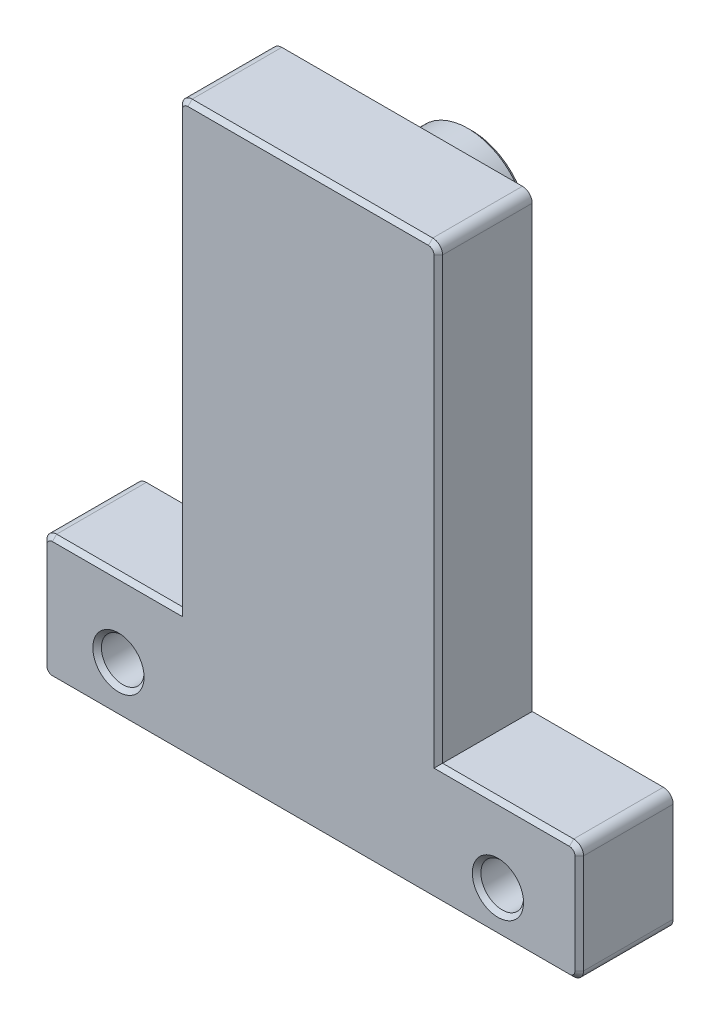
ISO-10303-21;
HEADER;
FILE_DESCRIPTION(('STEP AP214'),'2;1');
FILE_NAME('part.step','',(''),(''),'','','');
FILE_SCHEMA(('AUTOMOTIVE_DESIGN { 1 0 10303 214 1 1 1 1 }'));
ENDSEC;
DATA;
#1=APPLICATION_CONTEXT('core data for automotive mechanical design processes');
#2=APPLICATION_PROTOCOL_DEFINITION('international standard','automotive_design',2000,#1);
#3=PRODUCT_CONTEXT('',#1,'mechanical');
#4=PRODUCT('Part','Part','',(#3));
#5=PRODUCT_RELATED_PRODUCT_CATEGORY('part','',(#4));
#6=PRODUCT_DEFINITION_FORMATION('','',#4);
#7=PRODUCT_DEFINITION_CONTEXT('part definition',#1,'design');
#8=PRODUCT_DEFINITION('design','',#6,#7);
#9=PRODUCT_DEFINITION_SHAPE('','',#8);
#10=(LENGTH_UNIT() NAMED_UNIT(*) SI_UNIT(.MILLI.,.METRE.));
#11=(NAMED_UNIT(*) PLANE_ANGLE_UNIT() SI_UNIT($,.RADIAN.));
#12=(NAMED_UNIT(*) SI_UNIT($,.STERADIAN.) SOLID_ANGLE_UNIT());
#13=UNCERTAINTY_MEASURE_WITH_UNIT(LENGTH_MEASURE(1.E-05),#10,'distance_accuracy_value','');
#14=(GEOMETRIC_REPRESENTATION_CONTEXT(3) GLOBAL_UNCERTAINTY_ASSIGNED_CONTEXT((#13)) GLOBAL_UNIT_ASSIGNED_CONTEXT((#10,
#11,#12)) REPRESENTATION_CONTEXT('',''));
#15=CARTESIAN_POINT('',(0.,0.,0.));
#16=DIRECTION('',(0.,0.,1.));
#17=DIRECTION('',(1.,0.,0.));
#18=AXIS2_PLACEMENT_3D('',#15,#16,#17);
#19=CARTESIAN_POINT('',(73.787,72.009,2.2));
#20=DIRECTION('',(1.,0.,0.));
#21=DIRECTION('',(0.,0.,-1.));
#22=AXIS2_PLACEMENT_3D('',#19,#20,#21);
#23=PLANE('',#22);
#24=DIRECTION('',(0.,0.,-1.));
#25=VECTOR('',#24,1.);
#26=CARTESIAN_POINT('',(73.787,69.318,2.2));
#27=LINE('',#26,#25);
#28=CARTESIAN_POINT('',(73.787,69.318,0.));
#29=VERTEX_POINT('',#28);
#30=CARTESIAN_POINT('',(73.787,69.318,2.1));
#31=VERTEX_POINT('',#30);
#32=EDGE_CURVE('E261',#29,#31,#27,.F.);
#33=ORIENTED_EDGE('',*,*,#32,.T.);
#34=DIRECTION('',(0.,1.,0.));
#35=VECTOR('',#34,1.);
#36=CARTESIAN_POINT('',(73.787,72.009,2.1));
#37=LINE('',#36,#35);
#38=CARTESIAN_POINT('',(73.787,71.779,2.1));
#39=VERTEX_POINT('',#38);
#40=EDGE_CURVE('E370',#31,#39,#37,.T.);
#41=ORIENTED_EDGE('',*,*,#40,.T.);
#42=DIRECTION('',(0.,0.,-1.));
#43=VECTOR('',#42,1.);
#44=CARTESIAN_POINT('',(73.787,71.779,2.2));
#45=LINE('',#44,#43);
#46=CARTESIAN_POINT('',(73.787,71.779,0.));
#47=VERTEX_POINT('',#46);
#48=EDGE_CURVE('E258',#39,#47,#45,.T.);
#49=ORIENTED_EDGE('',*,*,#48,.T.);
#50=DIRECTION('',(0.,-1.,0.));
#51=VECTOR('',#50,1.);
#52=CARTESIAN_POINT('',(73.787,72.009,0.));
#53=LINE('',#52,#51);
#54=EDGE_CURVE('E475',#47,#29,#53,.T.);
#55=ORIENTED_EDGE('',*,*,#54,.T.);
#56=EDGE_LOOP('',(#33,#41,#49,#55));
#57=FACE_BOUND('',#56,.T.);
#58=ADVANCED_FACE('F41',(#57),#23,.F.);
#59=CARTESIAN_POINT('',(82.804,69.088,2.2));
#60=DIRECTION('',(0.,1.,0.));
#61=DIRECTION('',(0.,0.,1.));
#62=AXIS2_PLACEMENT_3D('',#59,#60,#61);
#63=PLANE('',#62);
#64=DIRECTION('',(0.,0.,-1.));
#65=VECTOR('',#64,1.);
#66=CARTESIAN_POINT('',(86.13,69.088,2.2));
#67=LINE('',#66,#65);
#68=CARTESIAN_POINT('',(86.13,69.088,0.));
#69=VERTEX_POINT('',#68);
#70=CARTESIAN_POINT('',(86.13,69.088,2.1));
#71=VERTEX_POINT('',#70);
#72=EDGE_CURVE('E200',#69,#71,#67,.F.);
#73=ORIENTED_EDGE('',*,*,#72,.T.);
#74=DIRECTION('',(-1.,0.,0.));
#75=VECTOR('',#74,1.);
#76=CARTESIAN_POINT('',(82.804,69.088,2.1));
#77=LINE('',#76,#75);
#78=CARTESIAN_POINT('',(74.017,69.088,2.1));
#79=VERTEX_POINT('',#78);
#80=EDGE_CURVE('E66',#71,#79,#77,.T.);
#81=ORIENTED_EDGE('',*,*,#80,.T.);
#82=DIRECTION('',(0.,0.,-1.));
#83=VECTOR('',#82,1.);
#84=CARTESIAN_POINT('',(74.017,69.088,2.2));
#85=LINE('',#84,#83);
#86=CARTESIAN_POINT('',(74.017,69.088,0.));
#87=VERTEX_POINT('',#86);
#88=EDGE_CURVE('E238',#79,#87,#85,.T.);
#89=ORIENTED_EDGE('',*,*,#88,.T.);
#90=DIRECTION('',(1.,0.,0.));
#91=VECTOR('',#90,1.);
#92=CARTESIAN_POINT('',(82.804,69.088,0.));
#93=LINE('',#92,#91);
#94=EDGE_CURVE('E479',#87,#69,#93,.T.);
#95=ORIENTED_EDGE('',*,*,#94,.T.);
#96=EDGE_LOOP('',(#73,#81,#89,#95));
#97=FACE_BOUND('',#96,.T.);
#98=ADVANCED_FACE('F507',(#97),#63,.F.);
#99=CARTESIAN_POINT('',(86.36,71.882,2.2));
#100=DIRECTION('',(-1.,0.,0.));
#101=DIRECTION('',(0.,0.,1.));
#102=AXIS2_PLACEMENT_3D('',#99,#100,#101);
#103=PLANE('',#102);
#104=DIRECTION('',(0.,0.,-1.));
#105=VECTOR('',#104,1.);
#106=CARTESIAN_POINT('',(86.36,71.652,2.2));
#107=LINE('',#106,#105);
#108=CARTESIAN_POINT('',(86.36,71.652,0.));
#109=VERTEX_POINT('',#108);
#110=CARTESIAN_POINT('',(86.36,71.652,2.1));
#111=VERTEX_POINT('',#110);
#112=EDGE_CURVE('E281',#109,#111,#107,.F.);
#113=ORIENTED_EDGE('',*,*,#112,.T.);
#114=DIRECTION('',(0.,-1.,0.));
#115=VECTOR('',#114,1.);
#116=CARTESIAN_POINT('',(86.36,71.882,2.1));
#117=LINE('',#116,#115);
#118=CARTESIAN_POINT('',(86.36,69.318,2.1));
#119=VERTEX_POINT('',#118);
#120=EDGE_CURVE('E360',#111,#119,#117,.T.);
#121=ORIENTED_EDGE('',*,*,#120,.T.);
#122=DIRECTION('',(0.,0.,-1.));
#123=VECTOR('',#122,1.);
#124=CARTESIAN_POINT('',(86.36,69.318,2.2));
#125=LINE('',#124,#123);
#126=CARTESIAN_POINT('',(86.36,69.318,0.));
#127=VERTEX_POINT('',#126);
#128=EDGE_CURVE('E285',#119,#127,#125,.T.);
#129=ORIENTED_EDGE('',*,*,#128,.T.);
#130=DIRECTION('',(0.,1.,0.));
#131=VECTOR('',#130,1.);
#132=CARTESIAN_POINT('',(86.36,71.882,0.));
#133=LINE('',#132,#131);
#134=EDGE_CURVE('E211',#127,#109,#133,.T.);
#135=ORIENTED_EDGE('',*,*,#134,.T.);
#136=EDGE_LOOP('',(#113,#121,#129,#135));
#137=FACE_BOUND('',#136,.T.);
#138=ADVANCED_FACE('F487',(#137),#103,.F.);
#139=CARTESIAN_POINT('',(83.058,71.882,2.2));
#140=DIRECTION('',(0.,-1.,0.));
#141=DIRECTION('',(0.,0.,-1.));
#142=AXIS2_PLACEMENT_3D('',#139,#140,#141);
#143=PLANE('',#142);
#144=DIRECTION('',(0.,0.,-1.));
#145=VECTOR('',#144,1.);
#146=CARTESIAN_POINT('',(83.058,71.882,2.2));
#147=LINE('',#146,#145);
#148=CARTESIAN_POINT('',(83.058,71.882,2.1));
#149=VERTEX_POINT('',#148);
#150=CARTESIAN_POINT('',(83.058,71.882,0.));
#151=VERTEX_POINT('',#150);
#152=EDGE_CURVE('E188',#149,#151,#147,.T.);
#153=ORIENTED_EDGE('',*,*,#152,.F.);
#154=DIRECTION('',(1.,0.,0.));
#155=VECTOR('',#154,1.);
#156=CARTESIAN_POINT('',(83.058,71.882,2.1));
#157=LINE('',#156,#155);
#158=CARTESIAN_POINT('',(86.13,71.882,2.1));
#159=VERTEX_POINT('',#158);
#160=EDGE_CURVE('E354',#149,#159,#157,.T.);
#161=ORIENTED_EDGE('',*,*,#160,.T.);
#162=DIRECTION('',(0.,0.,-1.));
#163=VECTOR('',#162,1.);
#164=CARTESIAN_POINT('',(86.13,71.882,2.2));
#165=LINE('',#164,#163);
#166=CARTESIAN_POINT('',(86.13,71.882,0.));
#167=VERTEX_POINT('',#166);
#168=EDGE_CURVE('E207',#159,#167,#165,.T.);
#169=ORIENTED_EDGE('',*,*,#168,.T.);
#170=DIRECTION('',(-1.,0.,0.));
#171=VECTOR('',#170,1.);
#172=CARTESIAN_POINT('',(83.058,71.882,0.));
#173=LINE('',#172,#171);
#174=EDGE_CURVE('E204',#167,#151,#173,.T.);
#175=ORIENTED_EDGE('',*,*,#174,.T.);
#176=EDGE_LOOP('',(#153,#161,#169,#175));
#177=FACE_BOUND('',#176,.T.);
#178=ADVANCED_FACE('F205',(#177),#143,.F.);
#179=CARTESIAN_POINT('',(83.058,82.423,2.2));
#180=DIRECTION('',(-1.,0.,0.));
#181=DIRECTION('',(0.,0.,1.));
#182=AXIS2_PLACEMENT_3D('',#179,#180,#181);
#183=PLANE('',#182);
#184=DIRECTION('',(0.,0.,-1.));
#185=VECTOR('',#184,1.);
#186=CARTESIAN_POINT('',(83.058,82.193,2.2));
#187=LINE('',#186,#185);
#188=CARTESIAN_POINT('',(83.058,82.193,0.));
#189=VERTEX_POINT('',#188);
#190=CARTESIAN_POINT('',(83.058,82.193,2.1));
#191=VERTEX_POINT('',#190);
#192=EDGE_CURVE('E278',#189,#191,#187,.F.);
#193=ORIENTED_EDGE('',*,*,#192,.T.);
#194=DIRECTION('',(0.,-1.,0.));
#195=VECTOR('',#194,1.);
#196=CARTESIAN_POINT('',(83.058,82.423,2.1));
#197=LINE('',#196,#195);
#198=EDGE_CURVE('E196',#191,#149,#197,.T.);
#199=ORIENTED_EDGE('',*,*,#198,.T.);
#200=ORIENTED_EDGE('',*,*,#152,.T.);
#201=DIRECTION('',(0.,1.,0.));
#202=VECTOR('',#201,1.);
#203=CARTESIAN_POINT('',(83.058,82.423,0.));
#204=LINE('',#203,#202);
#205=EDGE_CURVE('E193',#151,#189,#204,.T.);
#206=ORIENTED_EDGE('',*,*,#205,.T.);
#207=EDGE_LOOP('',(#193,#199,#200,#206));
#208=FACE_BOUND('',#207,.T.);
#209=ADVANCED_FACE('F191',(#208),#183,.F.);
#210=CARTESIAN_POINT('',(76.962,82.423,2.2));
#211=DIRECTION('',(0.,-1.,0.));
#212=DIRECTION('',(0.,0.,-1.));
#213=AXIS2_PLACEMENT_3D('',#210,#211,#212);
#214=PLANE('',#213);
#215=DIRECTION('',(0.,0.,-1.));
#216=VECTOR('',#215,1.);
#217=CARTESIAN_POINT('',(77.192,82.423,2.2));
#218=LINE('',#217,#216);
#219=CARTESIAN_POINT('',(77.192,82.423,0.));
#220=VERTEX_POINT('',#219);
#221=CARTESIAN_POINT('',(77.192,82.423,2.1));
#222=VERTEX_POINT('',#221);
#223=EDGE_CURVE('E274',#220,#222,#218,.F.);
#224=ORIENTED_EDGE('',*,*,#223,.T.);
#225=DIRECTION('',(1.,0.,0.));
#226=VECTOR('',#225,1.);
#227=CARTESIAN_POINT('',(76.962,82.423,2.1));
#228=LINE('',#227,#226);
#229=CARTESIAN_POINT('',(82.828,82.423,2.1));
#230=VERTEX_POINT('',#229);
#231=EDGE_CURVE('E346',#222,#230,#228,.T.);
#232=ORIENTED_EDGE('',*,*,#231,.T.);
#233=DIRECTION('',(0.,0.,-1.));
#234=VECTOR('',#233,1.);
#235=CARTESIAN_POINT('',(82.828,82.423,2.2));
#236=LINE('',#235,#234);
#237=CARTESIAN_POINT('',(82.828,82.423,0.));
#238=VERTEX_POINT('',#237);
#239=EDGE_CURVE('E271',#230,#238,#236,.T.);
#240=ORIENTED_EDGE('',*,*,#239,.T.);
#241=DIRECTION('',(-1.,0.,0.));
#242=VECTOR('',#241,1.);
#243=CARTESIAN_POINT('',(76.962,82.423,0.));
#244=LINE('',#243,#242);
#245=EDGE_CURVE('E219',#238,#220,#244,.T.);
#246=ORIENTED_EDGE('',*,*,#245,.T.);
#247=EDGE_LOOP('',(#224,#232,#240,#246));
#248=FACE_BOUND('',#247,.T.);
#249=ADVANCED_FACE('F536',(#248),#214,.F.);
#250=CARTESIAN_POINT('',(76.962,72.009,2.2));
#251=DIRECTION('',(1.,0.,0.));
#252=DIRECTION('',(0.,0.,-1.));
#253=AXIS2_PLACEMENT_3D('',#250,#251,#252);
#254=PLANE('',#253);
#255=DIRECTION('',(0.,0.,-1.));
#256=VECTOR('',#255,1.);
#257=CARTESIAN_POINT('',(76.962,72.009,2.2));
#258=LINE('',#257,#256);
#259=CARTESIAN_POINT('',(76.962,72.009,2.1));
#260=VERTEX_POINT('',#259);
#261=CARTESIAN_POINT('',(76.962,72.009,0.));
#262=VERTEX_POINT('',#261);
#263=EDGE_CURVE('E201',#260,#262,#258,.T.);
#264=ORIENTED_EDGE('',*,*,#263,.F.);
#265=DIRECTION('',(0.,1.,0.));
#266=VECTOR('',#265,1.);
#267=CARTESIAN_POINT('',(76.962,72.009,2.1));
#268=LINE('',#267,#266);
#269=CARTESIAN_POINT('',(76.962,82.193,2.1));
#270=VERTEX_POINT('',#269);
#271=EDGE_CURVE('E340',#260,#270,#268,.T.);
#272=ORIENTED_EDGE('',*,*,#271,.T.);
#273=DIRECTION('',(0.,0.,-1.));
#274=VECTOR('',#273,1.);
#275=CARTESIAN_POINT('',(76.962,82.193,2.2));
#276=LINE('',#275,#274);
#277=CARTESIAN_POINT('',(76.962,82.193,0.));
#278=VERTEX_POINT('',#277);
#279=EDGE_CURVE('E268',#270,#278,#276,.T.);
#280=ORIENTED_EDGE('',*,*,#279,.T.);
#281=DIRECTION('',(0.,-1.,0.));
#282=VECTOR('',#281,1.);
#283=CARTESIAN_POINT('',(76.962,72.009,0.));
#284=LINE('',#283,#282);
#285=EDGE_CURVE('E223',#278,#262,#284,.T.);
#286=ORIENTED_EDGE('',*,*,#285,.T.);
#287=EDGE_LOOP('',(#264,#272,#280,#286));
#288=FACE_BOUND('',#287,.T.);
#289=ADVANCED_FACE('F530',(#288),#254,.F.);
#290=CARTESIAN_POINT('',(73.787,72.009,2.2));
#291=DIRECTION('',(0.,-1.,0.));
#292=DIRECTION('',(0.,0.,-1.));
#293=AXIS2_PLACEMENT_3D('',#290,#291,#292);
#294=PLANE('',#293);
#295=DIRECTION('',(0.,0.,-1.));
#296=VECTOR('',#295,1.);
#297=CARTESIAN_POINT('',(74.017,72.009,2.2));
#298=LINE('',#297,#296);
#299=CARTESIAN_POINT('',(74.017,72.009,0.));
#300=VERTEX_POINT('',#299);
#301=CARTESIAN_POINT('',(74.017,72.009,2.1));
#302=VERTEX_POINT('',#301);
#303=EDGE_CURVE('E264',#300,#302,#298,.F.);
#304=ORIENTED_EDGE('',*,*,#303,.T.);
#305=DIRECTION('',(1.,0.,0.));
#306=VECTOR('',#305,1.);
#307=CARTESIAN_POINT('',(73.787,72.009,2.1));
#308=LINE('',#307,#306);
#309=EDGE_CURVE('E337',#302,#260,#308,.T.);
#310=ORIENTED_EDGE('',*,*,#309,.T.);
#311=ORIENTED_EDGE('',*,*,#263,.T.);
#312=DIRECTION('',(-1.,0.,0.));
#313=VECTOR('',#312,1.);
#314=CARTESIAN_POINT('',(73.787,72.009,0.));
#315=LINE('',#314,#313);
#316=EDGE_CURVE('E230',#262,#300,#315,.T.);
#317=ORIENTED_EDGE('',*,*,#316,.T.);
#318=EDGE_LOOP('',(#304,#310,#311,#317));
#319=FACE_BOUND('',#318,.T.);
#320=ADVANCED_FACE('F525',(#319),#294,.F.);
#321=CARTESIAN_POINT('',(0.,0.,2.2));
#322=DIRECTION('',(0.,0.,-1.));
#323=DIRECTION('',(-1.,0.,0.));
#324=AXIS2_PLACEMENT_3D('',#321,#322,#323);
#325=PLANE('',#324);
#326=CARTESIAN_POINT('',(84.455,70.104,2.2));
#327=DIRECTION('',(0.,0.,-1.));
#328=DIRECTION('',(-1.,0.,0.));
#329=AXIS2_PLACEMENT_3D('',#326,#327,#328);
#330=CIRCLE('',#329,0.600000000000003);
#331=CARTESIAN_POINT('',(83.855,70.104,2.2));
#332=VERTEX_POINT('',#331);
#333=EDGE_CURVE('E51',#332,#332,#330,.T.);
#334=ORIENTED_EDGE('',*,*,#333,.T.);
#335=EDGE_LOOP('',(#334));
#336=FACE_BOUND('',#335,.T.);
#337=CARTESIAN_POINT('',(75.565,70.231,2.2));
#338=DIRECTION('',(0.,0.,-1.));
#339=DIRECTION('',(-1.,0.,0.));
#340=AXIS2_PLACEMENT_3D('',#337,#338,#339);
#341=CIRCLE('',#340,0.600000000000003);
#342=CARTESIAN_POINT('',(74.965,70.231,2.2));
#343=VERTEX_POINT('',#342);
#344=EDGE_CURVE('E441',#343,#343,#341,.T.);
#345=ORIENTED_EDGE('',*,*,#344,.T.);
#346=EDGE_LOOP('',(#345));
#347=FACE_BOUND('',#346,.T.);
#348=DIRECTION('',(-1.,0.,0.));
#349=VECTOR('',#348,1.);
#350=CARTESIAN_POINT('',(0.,71.909,2.2));
#351=LINE('',#350,#349);
#352=CARTESIAN_POINT('',(77.062,71.909,2.2));
#353=VERTEX_POINT('',#352);
#354=CARTESIAN_POINT('',(74.017,71.909,2.2));
#355=VERTEX_POINT('',#354);
#356=EDGE_CURVE('E326',#353,#355,#351,.T.);
#357=ORIENTED_EDGE('',*,*,#356,.T.);
#358=CARTESIAN_POINT('',(74.017,71.779,2.2));
#359=DIRECTION('',(0.,0.,-1.));
#360=DIRECTION('',(-1.,0.,0.));
#361=AXIS2_PLACEMENT_3D('',#358,#359,#360);
#362=CIRCLE('',#361,0.129999999999991);
#363=CARTESIAN_POINT('',(73.887,71.779,2.2));
#364=VERTEX_POINT('',#363);
#365=EDGE_CURVE('E329',#355,#364,#362,.F.);
#366=ORIENTED_EDGE('',*,*,#365,.T.);
#367=DIRECTION('',(0.,-1.,0.));
#368=VECTOR('',#367,1.);
#369=CARTESIAN_POINT('',(73.887,0.,2.2));
#370=LINE('',#369,#368);
#371=CARTESIAN_POINT('',(73.887,69.318,2.2));
#372=VERTEX_POINT('',#371);
#373=EDGE_CURVE('E290',#364,#372,#370,.T.);
#374=ORIENTED_EDGE('',*,*,#373,.T.);
#375=CARTESIAN_POINT('',(74.017,69.318,2.2));
#376=DIRECTION('',(0.,0.,-1.));
#377=DIRECTION('',(-1.,0.,0.));
#378=AXIS2_PLACEMENT_3D('',#375,#376,#377);
#379=CIRCLE('',#378,0.129999999999991);
#380=CARTESIAN_POINT('',(74.017,69.188,2.2));
#381=VERTEX_POINT('',#380);
#382=EDGE_CURVE('E293',#372,#381,#379,.F.);
#383=ORIENTED_EDGE('',*,*,#382,.T.);
#384=DIRECTION('',(1.,0.,0.));
#385=VECTOR('',#384,1.);
#386=CARTESIAN_POINT('',(0.,69.188,2.2));
#387=LINE('',#386,#385);
#388=CARTESIAN_POINT('',(86.13,69.188,2.2));
#389=VERTEX_POINT('',#388);
#390=EDGE_CURVE('E296',#381,#389,#387,.T.);
#391=ORIENTED_EDGE('',*,*,#390,.T.);
#392=CARTESIAN_POINT('',(86.13,69.318,2.2));
#393=DIRECTION('',(0.,0.,-1.));
#394=DIRECTION('',(-1.,0.,0.));
#395=AXIS2_PLACEMENT_3D('',#392,#393,#394);
#396=CIRCLE('',#395,0.129999999999991);
#397=CARTESIAN_POINT('',(86.26,69.318,2.2));
#398=VERTEX_POINT('',#397);
#399=EDGE_CURVE('E299',#389,#398,#396,.F.);
#400=ORIENTED_EDGE('',*,*,#399,.T.);
#401=DIRECTION('',(0.,1.,0.));
#402=VECTOR('',#401,1.);
#403=CARTESIAN_POINT('',(86.26,0.,2.2));
#404=LINE('',#403,#402);
#405=CARTESIAN_POINT('',(86.26,71.652,2.2));
#406=VERTEX_POINT('',#405);
#407=EDGE_CURVE('E302',#398,#406,#404,.T.);
#408=ORIENTED_EDGE('',*,*,#407,.T.);
#409=CARTESIAN_POINT('',(86.13,71.652,2.2));
#410=DIRECTION('',(0.,0.,-1.));
#411=DIRECTION('',(-1.,0.,0.));
#412=AXIS2_PLACEMENT_3D('',#409,#410,#411);
#413=CIRCLE('',#412,0.129999999999991);
#414=CARTESIAN_POINT('',(86.13,71.782,2.2));
#415=VERTEX_POINT('',#414);
#416=EDGE_CURVE('E305',#406,#415,#413,.F.);
#417=ORIENTED_EDGE('',*,*,#416,.T.);
#418=DIRECTION('',(-1.,0.,0.));
#419=VECTOR('',#418,1.);
#420=CARTESIAN_POINT('',(0.,71.782,2.2));
#421=LINE('',#420,#419);
#422=CARTESIAN_POINT('',(82.958,71.782,2.2));
#423=VERTEX_POINT('',#422);
#424=EDGE_CURVE('E308',#415,#423,#421,.T.);
#425=ORIENTED_EDGE('',*,*,#424,.T.);
#426=DIRECTION('',(0.,1.,0.));
#427=VECTOR('',#426,1.);
#428=CARTESIAN_POINT('',(82.958,0.,2.2));
#429=LINE('',#428,#427);
#430=CARTESIAN_POINT('',(82.958,82.193,2.2));
#431=VERTEX_POINT('',#430);
#432=EDGE_CURVE('E311',#423,#431,#429,.T.);
#433=ORIENTED_EDGE('',*,*,#432,.T.);
#434=CARTESIAN_POINT('',(82.828,82.193,2.2));
#435=DIRECTION('',(0.,0.,-1.));
#436=DIRECTION('',(-1.,0.,0.));
#437=AXIS2_PLACEMENT_3D('',#434,#435,#436);
#438=CIRCLE('',#437,0.129999999999991);
#439=CARTESIAN_POINT('',(82.828,82.323,2.2));
#440=VERTEX_POINT('',#439);
#441=EDGE_CURVE('E314',#431,#440,#438,.F.);
#442=ORIENTED_EDGE('',*,*,#441,.T.);
#443=DIRECTION('',(-1.,0.,0.));
#444=VECTOR('',#443,1.);
#445=CARTESIAN_POINT('',(0.,82.323,2.2));
#446=LINE('',#445,#444);
#447=CARTESIAN_POINT('',(77.192,82.323,2.2));
#448=VERTEX_POINT('',#447);
#449=EDGE_CURVE('E317',#440,#448,#446,.T.);
#450=ORIENTED_EDGE('',*,*,#449,.T.);
#451=CARTESIAN_POINT('',(77.192,82.193,2.2));
#452=DIRECTION('',(0.,0.,-1.));
#453=DIRECTION('',(-1.,0.,0.));
#454=AXIS2_PLACEMENT_3D('',#451,#452,#453);
#455=CIRCLE('',#454,0.129999999999991);
#456=CARTESIAN_POINT('',(77.062,82.193,2.2));
#457=VERTEX_POINT('',#456);
#458=EDGE_CURVE('E320',#448,#457,#455,.F.);
#459=ORIENTED_EDGE('',*,*,#458,.T.);
#460=DIRECTION('',(0.,-1.,0.));
#461=VECTOR('',#460,1.);
#462=CARTESIAN_POINT('',(77.062,0.,2.2));
#463=LINE('',#462,#461);
#464=EDGE_CURVE('E323',#457,#353,#463,.T.);
#465=ORIENTED_EDGE('',*,*,#464,.T.);
#466=EDGE_LOOP('',(#357,#366,#374,#383,#391,#400,#408,#417,#425,#433,#442,#450,#459,#465));
#467=FACE_BOUND('',#466,.T.);
#468=ADVANCED_FACE('F448',(#336,#347,#467),#325,.F.);
#469=CARTESIAN_POINT('',(0.,0.,0.));
#470=DIRECTION('',(0.,0.,-1.));
#471=DIRECTION('',(-1.,0.,0.));
#472=AXIS2_PLACEMENT_3D('',#469,#470,#471);
#473=PLANE('',#472);
#474=CARTESIAN_POINT('',(75.565,70.231,0.));
#475=DIRECTION('',(0.,0.,-1.));
#476=DIRECTION('',(-1.,0.,0.));
#477=AXIS2_PLACEMENT_3D('',#474,#475,#476);
#478=CIRCLE('',#477,0.499999999999999);
#479=CARTESIAN_POINT('',(75.065,70.231,0.));
#480=VERTEX_POINT('',#479);
#481=EDGE_CURVE('E386',#480,#480,#478,.T.);
#482=ORIENTED_EDGE('',*,*,#481,.F.);
#483=EDGE_LOOP('',(#482));
#484=FACE_BOUND('',#483,.T.);
#485=CARTESIAN_POINT('',(84.455,70.104,0.));
#486=DIRECTION('',(0.,0.,-1.));
#487=DIRECTION('',(-1.,0.,0.));
#488=AXIS2_PLACEMENT_3D('',#485,#486,#487);
#489=CIRCLE('',#488,0.499999999999999);
#490=CARTESIAN_POINT('',(83.955,70.104,0.));
#491=VERTEX_POINT('',#490);
#492=EDGE_CURVE('E464',#491,#491,#489,.T.);
#493=ORIENTED_EDGE('',*,*,#492,.F.);
#494=EDGE_LOOP('',(#493));
#495=FACE_BOUND('',#494,.T.);
#496=CARTESIAN_POINT('',(80.00000002,80.00000002,0.));
#497=DIRECTION('',(0.,0.,-1.));
#498=DIRECTION('',(-1.,0.,0.));
#499=AXIS2_PLACEMENT_3D('',#496,#497,#498);
#500=CIRCLE('',#499,1.41);
#501=CARTESIAN_POINT('',(78.59000002,80.00000002,0.));
#502=VERTEX_POINT('',#501);
#503=EDGE_CURVE('E437',#502,#502,#500,.T.);
#504=ORIENTED_EDGE('',*,*,#503,.F.);
#505=EDGE_LOOP('',(#504));
#506=FACE_BOUND('',#505,.T.);
#507=ORIENTED_EDGE('',*,*,#94,.F.);
#508=CARTESIAN_POINT('',(74.017,69.318,0.));
#509=DIRECTION('',(0.,0.,-1.));
#510=DIRECTION('',(-1.,0.,0.));
#511=AXIS2_PLACEMENT_3D('',#508,#509,#510);
#512=CIRCLE('',#511,0.23);
#513=EDGE_CURVE('E255',#87,#29,#512,.T.);
#514=ORIENTED_EDGE('',*,*,#513,.T.);
#515=ORIENTED_EDGE('',*,*,#54,.F.);
#516=CARTESIAN_POINT('',(74.017,71.779,0.));
#517=DIRECTION('',(0.,0.,-1.));
#518=DIRECTION('',(-1.,0.,0.));
#519=AXIS2_PLACEMENT_3D('',#516,#517,#518);
#520=CIRCLE('',#519,0.23);
#521=EDGE_CURVE('E252',#47,#300,#520,.T.);
#522=ORIENTED_EDGE('',*,*,#521,.T.);
#523=ORIENTED_EDGE('',*,*,#316,.F.);
#524=ORIENTED_EDGE('',*,*,#285,.F.);
#525=CARTESIAN_POINT('',(77.192,82.193,0.));
#526=DIRECTION('',(0.,0.,-1.));
#527=DIRECTION('',(-1.,0.,0.));
#528=AXIS2_PLACEMENT_3D('',#525,#526,#527);
#529=CIRCLE('',#528,0.23);
#530=EDGE_CURVE('E249',#278,#220,#529,.T.);
#531=ORIENTED_EDGE('',*,*,#530,.T.);
#532=ORIENTED_EDGE('',*,*,#245,.F.);
#533=CARTESIAN_POINT('',(82.828,82.193,0.));
#534=DIRECTION('',(0.,0.,-1.));
#535=DIRECTION('',(-1.,0.,0.));
#536=AXIS2_PLACEMENT_3D('',#533,#534,#535);
#537=CIRCLE('',#536,0.23);
#538=EDGE_CURVE('E217',#238,#189,#537,.T.);
#539=ORIENTED_EDGE('',*,*,#538,.T.);
#540=ORIENTED_EDGE('',*,*,#205,.F.);
#541=ORIENTED_EDGE('',*,*,#174,.F.);
#542=CARTESIAN_POINT('',(86.13,71.652,0.));
#543=DIRECTION('',(0.,0.,-1.));
#544=DIRECTION('',(-1.,0.,0.));
#545=AXIS2_PLACEMENT_3D('',#542,#543,#544);
#546=CIRCLE('',#545,0.23);
#547=EDGE_CURVE('E241',#167,#109,#546,.T.);
#548=ORIENTED_EDGE('',*,*,#547,.T.);
#549=ORIENTED_EDGE('',*,*,#134,.F.);
#550=CARTESIAN_POINT('',(86.13,69.318,0.));
#551=DIRECTION('',(0.,0.,-1.));
#552=DIRECTION('',(-1.,0.,0.));
#553=AXIS2_PLACEMENT_3D('',#550,#551,#552);
#554=CIRCLE('',#553,0.23);
#555=EDGE_CURVE('E244',#127,#69,#554,.T.);
#556=ORIENTED_EDGE('',*,*,#555,.T.);
#557=EDGE_LOOP('',(#507,#514,#515,#522,#523,#524,#531,#532,#539,#540,#541,#548,#549,#556));
#558=FACE_BOUND('',#557,.T.);
#559=ADVANCED_FACE('F214',(#484,#495,#506,#558),#473,.T.);
#560=CARTESIAN_POINT('',(74.017,69.318,2.2));
#561=DIRECTION('',(0.,0.,-1.));
#562=DIRECTION('',(-1.,0.,0.));
#563=AXIS2_PLACEMENT_3D('',#560,#561,#562);
#564=CYLINDRICAL_SURFACE('',#563,0.23);
#565=ORIENTED_EDGE('',*,*,#88,.F.);
#566=CARTESIAN_POINT('',(74.017,69.318,2.1));
#567=DIRECTION('',(0.,0.,-1.));
#568=DIRECTION('',(-1.,0.,0.));
#569=AXIS2_PLACEMENT_3D('',#566,#567,#568);
#570=CIRCLE('',#569,0.23);
#571=EDGE_CURVE('E58',#79,#31,#570,.T.);
#572=ORIENTED_EDGE('',*,*,#571,.T.);
#573=ORIENTED_EDGE('',*,*,#32,.F.);
#574=ORIENTED_EDGE('',*,*,#513,.F.);
#575=EDGE_LOOP('',(#565,#572,#573,#574));
#576=FACE_BOUND('',#575,.T.);
#577=ADVANCED_FACE('F511',(#576),#564,.T.);
#578=CARTESIAN_POINT('',(74.017,71.779,2.2));
#579=DIRECTION('',(0.,0.,-1.));
#580=DIRECTION('',(-1.,0.,0.));
#581=AXIS2_PLACEMENT_3D('',#578,#579,#580);
#582=CYLINDRICAL_SURFACE('',#581,0.23);
#583=ORIENTED_EDGE('',*,*,#48,.F.);
#584=CARTESIAN_POINT('',(74.017,71.779,2.1));
#585=DIRECTION('',(0.,0.,-1.));
#586=DIRECTION('',(-1.,0.,0.));
#587=AXIS2_PLACEMENT_3D('',#584,#585,#586);
#588=CIRCLE('',#587,0.23);
#589=EDGE_CURVE('E333',#39,#302,#588,.T.);
#590=ORIENTED_EDGE('',*,*,#589,.T.);
#591=ORIENTED_EDGE('',*,*,#303,.F.);
#592=ORIENTED_EDGE('',*,*,#521,.F.);
#593=EDGE_LOOP('',(#583,#590,#591,#592));
#594=FACE_BOUND('',#593,.T.);
#595=ADVANCED_FACE('F521',(#594),#582,.T.);
#596=CARTESIAN_POINT('',(77.192,82.193,2.2));
#597=DIRECTION('',(0.,0.,-1.));
#598=DIRECTION('',(-1.,0.,0.));
#599=AXIS2_PLACEMENT_3D('',#596,#597,#598);
#600=CYLINDRICAL_SURFACE('',#599,0.23);
#601=ORIENTED_EDGE('',*,*,#279,.F.);
#602=CARTESIAN_POINT('',(77.192,82.193,2.1));
#603=DIRECTION('',(0.,0.,-1.));
#604=DIRECTION('',(-1.,0.,0.));
#605=AXIS2_PLACEMENT_3D('',#602,#603,#604);
#606=CIRCLE('',#605,0.23);
#607=EDGE_CURVE('E343',#270,#222,#606,.T.);
#608=ORIENTED_EDGE('',*,*,#607,.T.);
#609=ORIENTED_EDGE('',*,*,#223,.F.);
#610=ORIENTED_EDGE('',*,*,#530,.F.);
#611=EDGE_LOOP('',(#601,#608,#609,#610));
#612=FACE_BOUND('',#611,.T.);
#613=ADVANCED_FACE('F539',(#612),#600,.T.);
#614=CARTESIAN_POINT('',(82.828,82.193,2.2));
#615=DIRECTION('',(0.,0.,-1.));
#616=DIRECTION('',(-1.,0.,0.));
#617=AXIS2_PLACEMENT_3D('',#614,#615,#616);
#618=CYLINDRICAL_SURFACE('',#617,0.23);
#619=ORIENTED_EDGE('',*,*,#239,.F.);
#620=CARTESIAN_POINT('',(82.828,82.193,2.1));
#621=DIRECTION('',(0.,0.,-1.));
#622=DIRECTION('',(-1.,0.,0.));
#623=AXIS2_PLACEMENT_3D('',#620,#621,#622);
#624=CIRCLE('',#623,0.23);
#625=EDGE_CURVE('E349',#230,#191,#624,.T.);
#626=ORIENTED_EDGE('',*,*,#625,.T.);
#627=ORIENTED_EDGE('',*,*,#192,.F.);
#628=ORIENTED_EDGE('',*,*,#538,.F.);
#629=EDGE_LOOP('',(#619,#626,#627,#628));
#630=FACE_BOUND('',#629,.T.);
#631=ADVANCED_FACE('F560',(#630),#618,.T.);
#632=CARTESIAN_POINT('',(86.13,69.318,2.2));
#633=DIRECTION('',(0.,0.,-1.));
#634=DIRECTION('',(-1.,0.,0.));
#635=AXIS2_PLACEMENT_3D('',#632,#633,#634);
#636=CYLINDRICAL_SURFACE('',#635,0.23);
#637=ORIENTED_EDGE('',*,*,#128,.F.);
#638=CARTESIAN_POINT('',(86.13,69.318,2.1));
#639=DIRECTION('',(0.,0.,-1.));
#640=DIRECTION('',(-1.,0.,0.));
#641=AXIS2_PLACEMENT_3D('',#638,#639,#640);
#642=CIRCLE('',#641,0.23);
#643=EDGE_CURVE('E363',#119,#71,#642,.T.);
#644=ORIENTED_EDGE('',*,*,#643,.T.);
#645=ORIENTED_EDGE('',*,*,#72,.F.);
#646=ORIENTED_EDGE('',*,*,#555,.F.);
#647=EDGE_LOOP('',(#637,#644,#645,#646));
#648=FACE_BOUND('',#647,.T.);
#649=ADVANCED_FACE('F505',(#648),#636,.T.);
#650=CARTESIAN_POINT('',(86.13,71.652,2.2));
#651=DIRECTION('',(0.,0.,-1.));
#652=DIRECTION('',(-1.,0.,0.));
#653=AXIS2_PLACEMENT_3D('',#650,#651,#652);
#654=CYLINDRICAL_SURFACE('',#653,0.23);
#655=ORIENTED_EDGE('',*,*,#168,.F.);
#656=CARTESIAN_POINT('',(86.13,71.652,2.1));
#657=DIRECTION('',(0.,0.,-1.));
#658=DIRECTION('',(-1.,0.,0.));
#659=AXIS2_PLACEMENT_3D('',#656,#657,#658);
#660=CIRCLE('',#659,0.23);
#661=EDGE_CURVE('E357',#159,#111,#660,.T.);
#662=ORIENTED_EDGE('',*,*,#661,.T.);
#663=ORIENTED_EDGE('',*,*,#112,.F.);
#664=ORIENTED_EDGE('',*,*,#547,.F.);
#665=EDGE_LOOP('',(#655,#662,#663,#664));
#666=FACE_BOUND('',#665,.T.);
#667=ADVANCED_FACE('F492',(#666),#654,.T.);
#668=CARTESIAN_POINT('',(80.00000002,80.00000002,-1.65));
#669=DIRECTION('',(0.,0.,1.));
#670=DIRECTION('',(1.,0.,0.));
#671=AXIS2_PLACEMENT_3D('',#668,#669,#670);
#672=CYLINDRICAL_SURFACE('',#671,1.41);
#673=CARTESIAN_POINT('',(80.00000002,80.00000002,-1.55));
#674=DIRECTION('',(0.,0.,-1.));
#675=DIRECTION('',(-1.,0.,0.));
#676=AXIS2_PLACEMENT_3D('',#673,#674,#675);
#677=CIRCLE('',#676,1.41);
#678=CARTESIAN_POINT('',(78.59000002,80.00000002,-1.55));
#679=VERTEX_POINT('',#678);
#680=EDGE_CURVE('E377',#679,#679,#677,.F.);
#681=ORIENTED_EDGE('',*,*,#680,.T.);
#682=EDGE_LOOP('',(#681));
#683=FACE_BOUND('',#682,.T.);
#684=ORIENTED_EDGE('',*,*,#503,.T.);
#685=EDGE_LOOP('',(#684));
#686=FACE_BOUND('',#685,.T.);
#687=ADVANCED_FACE('F618',(#683,#686),#672,.T.);
#688=CARTESIAN_POINT('',(80.00000002,80.00000002,-1.65));
#689=DIRECTION('',(0.,0.,-1.));
#690=DIRECTION('',(-1.,0.,0.));
#691=AXIS2_PLACEMENT_3D('',#688,#689,#690);
#692=PLANE('',#691);
#693=CARTESIAN_POINT('',(80.00000002,80.00000002,-1.65));
#694=DIRECTION('',(0.,0.,-1.));
#695=DIRECTION('',(-1.,0.,0.));
#696=AXIS2_PLACEMENT_3D('',#693,#694,#695);
#697=CIRCLE('',#696,1.31000000000001);
#698=CARTESIAN_POINT('',(78.69000002,80.00000002,-1.65));
#699=VERTEX_POINT('',#698);
#700=EDGE_CURVE('E373',#699,#699,#697,.T.);
#701=ORIENTED_EDGE('',*,*,#700,.T.);
#702=EDGE_LOOP('',(#701));
#703=FACE_BOUND('',#702,.T.);
#704=ADVANCED_FACE('F674',(#703),#692,.T.);
#705=CARTESIAN_POINT('',(0.,71.782,2.2));
#706=DIRECTION('',(0.,-0.707106781186541,-0.707106781186554));
#707=DIRECTION('',(-1.,0.,0.));
#708=AXIS2_PLACEMENT_3D('',#705,#706,#707);
#709=PLANE('',#708);
#710=DIRECTION('',(0.,-0.707106781186554,0.707106781186541));
#711=VECTOR('',#710,1.);
#712=CARTESIAN_POINT('',(86.13,71.882,2.1));
#713=LINE('',#712,#711);
#714=EDGE_CURVE('E429',#159,#415,#713,.T.);
#715=ORIENTED_EDGE('',*,*,#714,.F.);
#716=ORIENTED_EDGE('',*,*,#160,.F.);
#717=DIRECTION('',(-0.577350269189629,-0.577350269189629,0.577350269189619));
#718=VECTOR('',#717,1.);
#719=CARTESIAN_POINT('',(59.0306666666664,47.8546666666664,26.1273333333332));
#720=LINE('',#719,#718);
#721=EDGE_CURVE('E433',#423,#149,#720,.F.);
#722=ORIENTED_EDGE('',*,*,#721,.F.);
#723=ORIENTED_EDGE('',*,*,#424,.F.);
#724=EDGE_LOOP('',(#715,#716,#722,#723));
#725=FACE_BOUND('',#724,.T.);
#726=ADVANCED_FACE('F570',(#725),#709,.F.);
#727=CARTESIAN_POINT('',(82.958,0.,2.2));
#728=DIRECTION('',(-0.707106781186541,0.,-0.707106781186554));
#729=DIRECTION('',(0.,1.,0.));
#730=AXIS2_PLACEMENT_3D('',#727,#728,#729);
#731=PLANE('',#730);
#732=ORIENTED_EDGE('',*,*,#721,.T.);
#733=ORIENTED_EDGE('',*,*,#198,.F.);
#734=DIRECTION('',(0.707106781186554,0.,-0.707106781186541));
#735=VECTOR('',#734,1.);
#736=CARTESIAN_POINT('',(82.958,82.193,2.2));
#737=LINE('',#736,#735);
#738=EDGE_CURVE('E425',#431,#191,#737,.T.);
#739=ORIENTED_EDGE('',*,*,#738,.F.);
#740=ORIENTED_EDGE('',*,*,#432,.F.);
#741=EDGE_LOOP('',(#732,#733,#739,#740));
#742=FACE_BOUND('',#741,.T.);
#743=ADVANCED_FACE('F566',(#742),#731,.F.);
#744=CARTESIAN_POINT('',(86.13,71.652,2.2));
#745=DIRECTION('',(0.,0.,-1.));
#746=DIRECTION('',(-1.,0.,0.));
#747=AXIS2_PLACEMENT_3D('',#744,#745,#746);
#748=CONICAL_SURFACE('',#747,0.129999999999991,0.785398163397487);
#749=ORIENTED_EDGE('',*,*,#714,.T.);
#750=ORIENTED_EDGE('',*,*,#416,.F.);
#751=DIRECTION('',(-0.707106781186554,0.,0.707106781186541));
#752=VECTOR('',#751,1.);
#753=CARTESIAN_POINT('',(86.36,71.652,2.1));
#754=LINE('',#753,#752);
#755=EDGE_CURVE('E421',#111,#406,#754,.T.);
#756=ORIENTED_EDGE('',*,*,#755,.F.);
#757=ORIENTED_EDGE('',*,*,#661,.F.);
#758=EDGE_LOOP('',(#749,#750,#756,#757));
#759=FACE_BOUND('',#758,.T.);
#760=ADVANCED_FACE('F496',(#759),#748,.T.);
#761=CARTESIAN_POINT('',(82.828,82.193,2.2));
#762=DIRECTION('',(0.,0.,-1.));
#763=DIRECTION('',(-1.,0.,0.));
#764=AXIS2_PLACEMENT_3D('',#761,#762,#763);
#765=CONICAL_SURFACE('',#764,0.129999999999991,0.785398163397487);
#766=ORIENTED_EDGE('',*,*,#738,.T.);
#767=ORIENTED_EDGE('',*,*,#625,.F.);
#768=DIRECTION('',(0.,0.707106781186554,-0.707106781186541));
#769=VECTOR('',#768,1.);
#770=CARTESIAN_POINT('',(82.828,82.323,2.2));
#771=LINE('',#770,#769);
#772=EDGE_CURVE('E417',#440,#230,#771,.T.);
#773=ORIENTED_EDGE('',*,*,#772,.F.);
#774=ORIENTED_EDGE('',*,*,#441,.F.);
#775=EDGE_LOOP('',(#766,#767,#773,#774));
#776=FACE_BOUND('',#775,.T.);
#777=ADVANCED_FACE('F562',(#776),#765,.T.);
#778=CARTESIAN_POINT('',(86.26,0.,2.2));
#779=DIRECTION('',(-0.707106781186541,0.,-0.707106781186554));
#780=DIRECTION('',(0.,1.,0.));
#781=AXIS2_PLACEMENT_3D('',#778,#779,#780);
#782=PLANE('',#781);
#783=ORIENTED_EDGE('',*,*,#755,.T.);
#784=ORIENTED_EDGE('',*,*,#407,.F.);
#785=DIRECTION('',(-0.707106781186554,0.,0.707106781186541));
#786=VECTOR('',#785,1.);
#787=CARTESIAN_POINT('',(86.36,69.318,2.1));
#788=LINE('',#787,#786);
#789=EDGE_CURVE('E413',#119,#398,#788,.T.);
#790=ORIENTED_EDGE('',*,*,#789,.F.);
#791=ORIENTED_EDGE('',*,*,#120,.F.);
#792=EDGE_LOOP('',(#783,#784,#790,#791));
#793=FACE_BOUND('',#792,.T.);
#794=ADVANCED_FACE('F502',(#793),#782,.F.);
#795=CARTESIAN_POINT('',(0.,82.323,2.2));
#796=DIRECTION('',(0.,-0.707106781186541,-0.707106781186554));
#797=DIRECTION('',(-1.,0.,0.));
#798=AXIS2_PLACEMENT_3D('',#795,#796,#797);
#799=PLANE('',#798);
#800=ORIENTED_EDGE('',*,*,#772,.T.);
#801=ORIENTED_EDGE('',*,*,#231,.F.);
#802=DIRECTION('',(0.,0.707106781186554,-0.707106781186541));
#803=VECTOR('',#802,1.);
#804=CARTESIAN_POINT('',(77.192,82.323,2.2));
#805=LINE('',#804,#803);
#806=EDGE_CURVE('E409',#448,#222,#805,.T.);
#807=ORIENTED_EDGE('',*,*,#806,.F.);
#808=ORIENTED_EDGE('',*,*,#449,.F.);
#809=EDGE_LOOP('',(#800,#801,#807,#808));
#810=FACE_BOUND('',#809,.T.);
#811=ADVANCED_FACE('F557',(#810),#799,.F.);
#812=CARTESIAN_POINT('',(86.13,69.318,2.2));
#813=DIRECTION('',(0.,0.,-1.));
#814=DIRECTION('',(-1.,0.,0.));
#815=AXIS2_PLACEMENT_3D('',#812,#813,#814);
#816=CONICAL_SURFACE('',#815,0.129999999999991,0.785398163397487);
#817=ORIENTED_EDGE('',*,*,#789,.T.);
#818=ORIENTED_EDGE('',*,*,#399,.F.);
#819=DIRECTION('',(0.,0.707106781186554,0.707106781186541));
#820=VECTOR('',#819,1.);
#821=CARTESIAN_POINT('',(86.13,69.088,2.1));
#822=LINE('',#821,#820);
#823=EDGE_CURVE('E405',#71,#389,#822,.T.);
#824=ORIENTED_EDGE('',*,*,#823,.F.);
#825=ORIENTED_EDGE('',*,*,#643,.F.);
#826=EDGE_LOOP('',(#817,#818,#824,#825));
#827=FACE_BOUND('',#826,.T.);
#828=ADVANCED_FACE('F573',(#827),#816,.T.);
#829=CARTESIAN_POINT('',(77.192,82.193,2.2));
#830=DIRECTION('',(0.,0.,-1.));
#831=DIRECTION('',(-1.,0.,0.));
#832=AXIS2_PLACEMENT_3D('',#829,#830,#831);
#833=CONICAL_SURFACE('',#832,0.129999999999991,0.785398163397487);
#834=ORIENTED_EDGE('',*,*,#806,.T.);
#835=ORIENTED_EDGE('',*,*,#607,.F.);
#836=DIRECTION('',(-0.707106781186554,0.,-0.707106781186541));
#837=VECTOR('',#836,1.);
#838=CARTESIAN_POINT('',(77.062,82.193,2.2));
#839=LINE('',#838,#837);
#840=EDGE_CURVE('E401',#457,#270,#839,.T.);
#841=ORIENTED_EDGE('',*,*,#840,.F.);
#842=ORIENTED_EDGE('',*,*,#458,.F.);
#843=EDGE_LOOP('',(#834,#835,#841,#842));
#844=FACE_BOUND('',#843,.T.);
#845=ADVANCED_FACE('F543',(#844),#833,.T.);
#846=CARTESIAN_POINT('',(0.,69.188,2.2));
#847=DIRECTION('',(0.,0.707106781186541,-0.707106781186554));
#848=DIRECTION('',(1.,0.,0.));
#849=AXIS2_PLACEMENT_3D('',#846,#847,#848);
#850=PLANE('',#849);
#851=ORIENTED_EDGE('',*,*,#823,.T.);
#852=ORIENTED_EDGE('',*,*,#390,.F.);
#853=DIRECTION('',(0.,0.707106781186554,0.707106781186541));
#854=VECTOR('',#853,1.);
#855=CARTESIAN_POINT('',(74.017,69.088,2.1));
#856=LINE('',#855,#854);
#857=EDGE_CURVE('E397',#79,#381,#856,.T.);
#858=ORIENTED_EDGE('',*,*,#857,.F.);
#859=ORIENTED_EDGE('',*,*,#80,.F.);
#860=EDGE_LOOP('',(#851,#852,#858,#859));
#861=FACE_BOUND('',#860,.T.);
#862=ADVANCED_FACE('F576',(#861),#850,.F.);
#863=CARTESIAN_POINT('',(77.062,0.,2.2));
#864=DIRECTION('',(0.707106781186541,0.,-0.707106781186554));
#865=DIRECTION('',(0.,-1.,0.));
#866=AXIS2_PLACEMENT_3D('',#863,#864,#865);
#867=PLANE('',#866);
#868=ORIENTED_EDGE('',*,*,#840,.T.);
#869=ORIENTED_EDGE('',*,*,#271,.F.);
#870=DIRECTION('',(0.577350269189629,-0.577350269189629,0.577350269189619));
#871=VECTOR('',#870,1.);
#872=CARTESIAN_POINT('',(51.3746666666664,97.5963333333336,-23.4873333333332));
#873=LINE('',#872,#871);
#874=EDGE_CURVE('E393',#353,#260,#873,.F.);
#875=ORIENTED_EDGE('',*,*,#874,.F.);
#876=ORIENTED_EDGE('',*,*,#464,.F.);
#877=EDGE_LOOP('',(#868,#869,#875,#876));
#878=FACE_BOUND('',#877,.T.);
#879=ADVANCED_FACE('F548',(#878),#867,.F.);
#880=CARTESIAN_POINT('',(74.017,69.318,2.2));
#881=DIRECTION('',(0.,0.,-1.));
#882=DIRECTION('',(-1.,0.,0.));
#883=AXIS2_PLACEMENT_3D('',#880,#881,#882);
#884=CONICAL_SURFACE('',#883,0.129999999999991,0.785398163397487);
#885=ORIENTED_EDGE('',*,*,#857,.T.);
#886=ORIENTED_EDGE('',*,*,#382,.F.);
#887=DIRECTION('',(0.707106781186554,0.,0.707106781186541));
#888=VECTOR('',#887,1.);
#889=CARTESIAN_POINT('',(73.787,69.318,2.1));
#890=LINE('',#889,#888);
#891=EDGE_CURVE('E389',#31,#372,#890,.T.);
#892=ORIENTED_EDGE('',*,*,#891,.F.);
#893=ORIENTED_EDGE('',*,*,#571,.F.);
#894=EDGE_LOOP('',(#885,#886,#892,#893));
#895=FACE_BOUND('',#894,.T.);
#896=ADVANCED_FACE('F579',(#895),#884,.T.);
#897=CARTESIAN_POINT('',(0.,71.909,2.2));
#898=DIRECTION('',(0.,-0.707106781186541,-0.707106781186554));
#899=DIRECTION('',(-1.,0.,0.));
#900=AXIS2_PLACEMENT_3D('',#897,#898,#899);
#901=PLANE('',#900);
#902=ORIENTED_EDGE('',*,*,#874,.T.);
#903=ORIENTED_EDGE('',*,*,#309,.F.);
#904=DIRECTION('',(0.,0.707106781186554,-0.707106781186541));
#905=VECTOR('',#904,1.);
#906=CARTESIAN_POINT('',(74.017,71.909,2.2));
#907=LINE('',#906,#905);
#908=EDGE_CURVE('E385',#355,#302,#907,.T.);
#909=ORIENTED_EDGE('',*,*,#908,.F.);
#910=ORIENTED_EDGE('',*,*,#356,.F.);
#911=EDGE_LOOP('',(#902,#903,#909,#910));
#912=FACE_BOUND('',#911,.T.);
#913=ADVANCED_FACE('F588',(#912),#901,.F.);
#914=CARTESIAN_POINT('',(73.887,0.,2.2));
#915=DIRECTION('',(0.707106781186541,0.,-0.707106781186554));
#916=DIRECTION('',(0.,-1.,0.));
#917=AXIS2_PLACEMENT_3D('',#914,#915,#916);
#918=PLANE('',#917);
#919=ORIENTED_EDGE('',*,*,#891,.T.);
#920=ORIENTED_EDGE('',*,*,#373,.F.);
#921=DIRECTION('',(0.707106781186554,0.,0.707106781186541));
#922=VECTOR('',#921,1.);
#923=CARTESIAN_POINT('',(73.787,71.779,2.1));
#924=LINE('',#923,#922);
#925=EDGE_CURVE('E382',#39,#364,#924,.T.);
#926=ORIENTED_EDGE('',*,*,#925,.F.);
#927=ORIENTED_EDGE('',*,*,#40,.F.);
#928=EDGE_LOOP('',(#919,#920,#926,#927));
#929=FACE_BOUND('',#928,.T.);
#930=ADVANCED_FACE('F583',(#929),#918,.F.);
#931=CARTESIAN_POINT('',(74.017,71.779,2.2));
#932=DIRECTION('',(0.,0.,-1.));
#933=DIRECTION('',(-1.,0.,0.));
#934=AXIS2_PLACEMENT_3D('',#931,#932,#933);
#935=CONICAL_SURFACE('',#934,0.129999999999991,0.785398163397487);
#936=ORIENTED_EDGE('',*,*,#908,.T.);
#937=ORIENTED_EDGE('',*,*,#589,.F.);
#938=ORIENTED_EDGE('',*,*,#925,.T.);
#939=ORIENTED_EDGE('',*,*,#365,.F.);
#940=EDGE_LOOP('',(#936,#937,#938,#939));
#941=FACE_BOUND('',#940,.T.);
#942=ADVANCED_FACE('F586',(#941),#935,.T.);
#943=CARTESIAN_POINT('',(80.00000002,80.00000002,-1.65));
#944=DIRECTION('',(0.,0.,1.));
#945=DIRECTION('',(1.,0.,0.));
#946=AXIS2_PLACEMENT_3D('',#943,#944,#945);
#947=CONICAL_SURFACE('',#946,1.31000000000001,0.785398163397408);
#948=ORIENTED_EDGE('',*,*,#680,.F.);
#949=EDGE_LOOP('',(#948));
#950=FACE_BOUND('',#949,.T.);
#951=ORIENTED_EDGE('',*,*,#700,.F.);
#952=EDGE_LOOP('',(#951));
#953=FACE_BOUND('',#952,.T.);
#954=ADVANCED_FACE('F460',(#950,#953),#947,.T.);
#955=CARTESIAN_POINT('',(84.455,70.104,3.6142135623731));
#956=DIRECTION('',(0.,0.,-1.));
#957=DIRECTION('',(-1.,0.,0.));
#958=AXIS2_PLACEMENT_3D('',#955,#956,#957);
#959=CYLINDRICAL_SURFACE('',#958,0.499999999999999);
#960=CARTESIAN_POINT('',(84.455,70.104,2.1));
#961=DIRECTION('',(0.,0.,-1.));
#962=DIRECTION('',(-1.,0.,0.));
#963=AXIS2_PLACEMENT_3D('',#960,#961,#962);
#964=CIRCLE('',#963,0.499999999999999);
#965=CARTESIAN_POINT('',(83.955,70.104,2.1));
#966=VERTEX_POINT('',#965);
#967=EDGE_CURVE('E381',#966,#966,#964,.F.);
#968=ORIENTED_EDGE('',*,*,#967,.T.);
#969=EDGE_LOOP('',(#968));
#970=FACE_BOUND('',#969,.T.);
#971=ORIENTED_EDGE('',*,*,#492,.T.);
#972=EDGE_LOOP('',(#971));
#973=FACE_BOUND('',#972,.T.);
#974=ADVANCED_FACE('F457',(#970,#973),#959,.F.);
#975=CARTESIAN_POINT('',(75.565,70.231,3.6142135623731));
#976=DIRECTION('',(0.,0.,-1.));
#977=DIRECTION('',(-1.,0.,0.));
#978=AXIS2_PLACEMENT_3D('',#975,#976,#977);
#979=CYLINDRICAL_SURFACE('',#978,0.499999999999999);
#980=CARTESIAN_POINT('',(75.565,70.231,2.1));
#981=DIRECTION('',(0.,0.,-1.));
#982=DIRECTION('',(-1.,0.,0.));
#983=AXIS2_PLACEMENT_3D('',#980,#981,#982);
#984=CIRCLE('',#983,0.499999999999999);
#985=CARTESIAN_POINT('',(75.065,70.231,2.1));
#986=VERTEX_POINT('',#985);
#987=EDGE_CURVE('E11',#986,#986,#984,.F.);
#988=ORIENTED_EDGE('',*,*,#987,.T.);
#989=EDGE_LOOP('',(#988));
#990=FACE_BOUND('',#989,.T.);
#991=ORIENTED_EDGE('',*,*,#481,.T.);
#992=EDGE_LOOP('',(#991));
#993=FACE_BOUND('',#992,.T.);
#994=ADVANCED_FACE('F454',(#990,#993),#979,.F.);
#995=CARTESIAN_POINT('',(84.455,70.104,2.1));
#996=DIRECTION('',(0.,0.,1.));
#997=DIRECTION('',(1.,0.,0.));
#998=AXIS2_PLACEMENT_3D('',#995,#996,#997);
#999=CONICAL_SURFACE('',#998,0.499999999999999,0.785398163397444);
#1000=ORIENTED_EDGE('',*,*,#333,.F.);
#1001=EDGE_LOOP('',(#1000));
#1002=FACE_BOUND('',#1001,.T.);
#1003=ORIENTED_EDGE('',*,*,#967,.F.);
#1004=EDGE_LOOP('',(#1003));
#1005=FACE_BOUND('',#1004,.T.);
#1006=ADVANCED_FACE('F451',(#1002,#1005),#999,.F.);
#1007=CARTESIAN_POINT('',(75.565,70.231,2.1));
#1008=DIRECTION('',(0.,0.,1.));
#1009=DIRECTION('',(1.,0.,0.));
#1010=AXIS2_PLACEMENT_3D('',#1007,#1008,#1009);
#1011=CONICAL_SURFACE('',#1010,0.499999999999999,0.785398163397444);
#1012=ORIENTED_EDGE('',*,*,#344,.F.);
#1013=EDGE_LOOP('',(#1012));
#1014=FACE_BOUND('',#1013,.T.);
#1015=ORIENTED_EDGE('',*,*,#987,.F.);
#1016=EDGE_LOOP('',(#1015));
#1017=FACE_BOUND('',#1016,.T.);
#1018=ADVANCED_FACE('F44',(#1014,#1017),#1011,.F.);
#1019=CLOSED_SHELL('',(#58,#98,#138,#178,#209,#249,#289,#320,#468,#559,#577,#595,#613,#631,#649,
#667,#687,#704,#726,#743,#760,#777,#794,#811,#828,#845,#862,#879,#896,#913,#930,#942,#954,#974,
#994,#1006,#1018));
#1020=MANIFOLD_SOLID_BREP('B2',#1019);
#1021=ADVANCED_BREP_SHAPE_REPRESENTATION('',(#18,#1020),#14);
#1022=SHAPE_DEFINITION_REPRESENTATION(#9,#1021);
ENDSEC;
END-ISO-10303-21;
